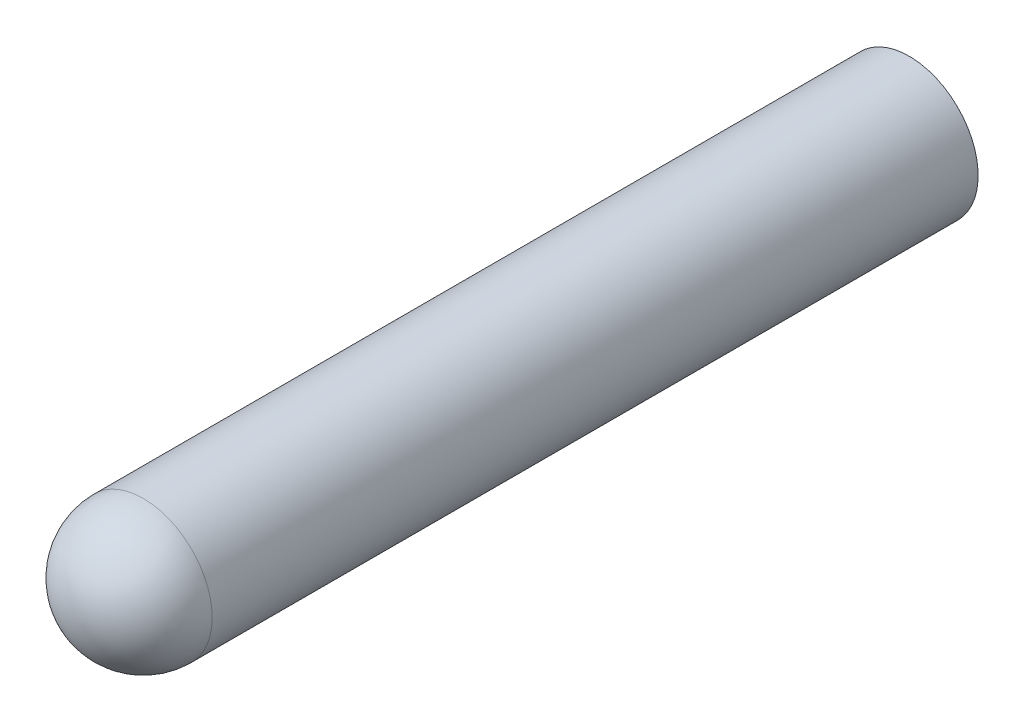
ISO-10303-21;
HEADER;
FILE_DESCRIPTION(('STEP AP214'),'2;1');
FILE_NAME('part.step','',(''),(''),'','','');
FILE_SCHEMA(('AUTOMOTIVE_DESIGN { 1 0 10303 214 1 1 1 1 }'));
ENDSEC;
DATA;
#1=APPLICATION_CONTEXT('core data for automotive mechanical design processes');
#2=APPLICATION_PROTOCOL_DEFINITION('international standard','automotive_design',2000,#1);
#3=PRODUCT_CONTEXT('',#1,'mechanical');
#4=PRODUCT('Part','Part','',(#3));
#5=PRODUCT_RELATED_PRODUCT_CATEGORY('part','',(#4));
#6=PRODUCT_DEFINITION_FORMATION('','',#4);
#7=PRODUCT_DEFINITION_CONTEXT('part definition',#1,'design');
#8=PRODUCT_DEFINITION('design','',#6,#7);
#9=PRODUCT_DEFINITION_SHAPE('','',#8);
#10=(LENGTH_UNIT() NAMED_UNIT(*) SI_UNIT(.MILLI.,.METRE.));
#11=(NAMED_UNIT(*) PLANE_ANGLE_UNIT() SI_UNIT($,.RADIAN.));
#12=(NAMED_UNIT(*) SI_UNIT($,.STERADIAN.) SOLID_ANGLE_UNIT());
#13=UNCERTAINTY_MEASURE_WITH_UNIT(LENGTH_MEASURE(1.E-05),#10,'distance_accuracy_value','');
#14=(GEOMETRIC_REPRESENTATION_CONTEXT(3) GLOBAL_UNCERTAINTY_ASSIGNED_CONTEXT((#13)) GLOBAL_UNIT_ASSIGNED_CONTEXT((#10,
#11,#12)) REPRESENTATION_CONTEXT('',''));
#15=CARTESIAN_POINT('',(0.,0.,0.));
#16=DIRECTION('',(0.,0.,1.));
#17=DIRECTION('',(1.,0.,0.));
#18=AXIS2_PLACEMENT_3D('',#15,#16,#17);
#19=CARTESIAN_POINT('',(8.25,0.,-72.75));
#20=DIRECTION('',(0.,0.,1.));
#21=DIRECTION('',(1.,0.,0.));
#22=AXIS2_PLACEMENT_3D('',#19,#20,#21);
#23=PLANE('',#22);
#24=CARTESIAN_POINT('',(0.,0.,-72.75));
#25=DIRECTION('',(0.,0.,-1.));
#26=DIRECTION('',(-1.,0.,0.));
#27=AXIS2_PLACEMENT_3D('',#24,#25,#26);
#28=CIRCLE('',#27,6.75);
#29=CARTESIAN_POINT('',(-6.75,0.,-72.75));
#30=VERTEX_POINT('',#29);
#31=EDGE_CURVE('E10',#30,#30,#28,.T.);
#32=ORIENTED_EDGE('',*,*,#31,.F.);
#33=EDGE_LOOP('',(#32));
#34=FACE_BOUND('',#33,.T.);
#35=CARTESIAN_POINT('',(0.,0.,-72.75));
#36=DIRECTION('',(0.,0.,-1.));
#37=DIRECTION('',(-1.,0.,0.));
#38=AXIS2_PLACEMENT_3D('',#35,#36,#37);
#39=CIRCLE('',#38,8.25);
#40=CARTESIAN_POINT('',(-8.25,0.,-72.75));
#41=VERTEX_POINT('',#40);
#42=EDGE_CURVE('E46',#41,#41,#39,.T.);
#43=ORIENTED_EDGE('',*,*,#42,.T.);
#44=EDGE_LOOP('',(#43));
#45=FACE_BOUND('',#44,.T.);
#46=ADVANCED_FACE('F32',(#34,#45),#23,.F.);
#47=CARTESIAN_POINT('',(0.,0.,30.3066564574692));
#48=DIRECTION('',(0.,0.,-1.));
#49=DIRECTION('',(-1.,0.,0.));
#50=AXIS2_PLACEMENT_3D('',#47,#48,#49);
#51=CYLINDRICAL_SURFACE('',#50,6.75000000000001);
#52=CARTESIAN_POINT('',(0.,0.,19.));
#53=DIRECTION('',(0.,0.,-1.));
#54=DIRECTION('',(-1.,0.,0.));
#55=AXIS2_PLACEMENT_3D('',#52,#53,#54);
#56=CIRCLE('',#55,6.75000000000001);
#57=CARTESIAN_POINT('',(-6.75000000000001,0.,19.));
#58=VERTEX_POINT('',#57);
#59=EDGE_CURVE('E38',#58,#58,#56,.T.);
#60=ORIENTED_EDGE('',*,*,#59,.F.);
#61=EDGE_LOOP('',(#60));
#62=FACE_BOUND('',#61,.T.);
#63=ORIENTED_EDGE('',*,*,#31,.T.);
#64=EDGE_LOOP('',(#63));
#65=FACE_BOUND('',#64,.T.);
#66=ADVANCED_FACE('F66',(#62,#65),#51,.F.);
#67=CARTESIAN_POINT('',(0.,0.,19.));
#68=DIRECTION('',(0.,0.,-1.));
#69=DIRECTION('',(1.,0.,0.));
#70=AXIS2_PLACEMENT_3D('',#67,#68,#69);
#71=SPHERICAL_SURFACE('',#70,6.75000000000001);
#72=ORIENTED_EDGE('',*,*,#59,.T.);
#73=EDGE_LOOP('',(#72));
#74=FACE_BOUND('',#73,.T.);
#75=ADVANCED_FACE('F61',(#74),#71,.F.);
#76=CARTESIAN_POINT('',(0.,0.,19.));
#77=DIRECTION('',(0.,0.,-1.));
#78=DIRECTION('',(1.,0.,0.));
#79=AXIS2_PLACEMENT_3D('',#76,#77,#78);
#80=SPHERICAL_SURFACE('',#79,8.25);
#81=CARTESIAN_POINT('',(0.,0.,19.));
#82=DIRECTION('',(0.,0.,-1.));
#83=DIRECTION('',(-1.,0.,0.));
#84=AXIS2_PLACEMENT_3D('',#81,#82,#83);
#85=CIRCLE('',#84,8.25);
#86=CARTESIAN_POINT('',(-8.25,0.,19.));
#87=VERTEX_POINT('',#86);
#88=EDGE_CURVE('E42',#87,#87,#85,.T.);
#89=ORIENTED_EDGE('',*,*,#88,.F.);
#90=EDGE_LOOP('',(#89));
#91=FACE_BOUND('',#90,.T.);
#92=ADVANCED_FACE('F56',(#91),#80,.T.);
#93=CARTESIAN_POINT('',(0.,0.,30.3066564574692));
#94=DIRECTION('',(0.,0.,-1.));
#95=DIRECTION('',(-1.,0.,0.));
#96=AXIS2_PLACEMENT_3D('',#93,#94,#95);
#97=CYLINDRICAL_SURFACE('',#96,8.25);
#98=ORIENTED_EDGE('',*,*,#42,.F.);
#99=EDGE_LOOP('',(#98));
#100=FACE_BOUND('',#99,.T.);
#101=ORIENTED_EDGE('',*,*,#88,.T.);
#102=EDGE_LOOP('',(#101));
#103=FACE_BOUND('',#102,.T.);
#104=ADVANCED_FACE('F53',(#100,#103),#97,.T.);
#105=CLOSED_SHELL('',(#46,#66,#75,#92,#104));
#106=MANIFOLD_SOLID_BREP('B2',#105);
#107=ADVANCED_BREP_SHAPE_REPRESENTATION('',(#18,#106),#14);
#108=SHAPE_DEFINITION_REPRESENTATION(#9,#107);
ENDSEC;
END-ISO-10303-21;
